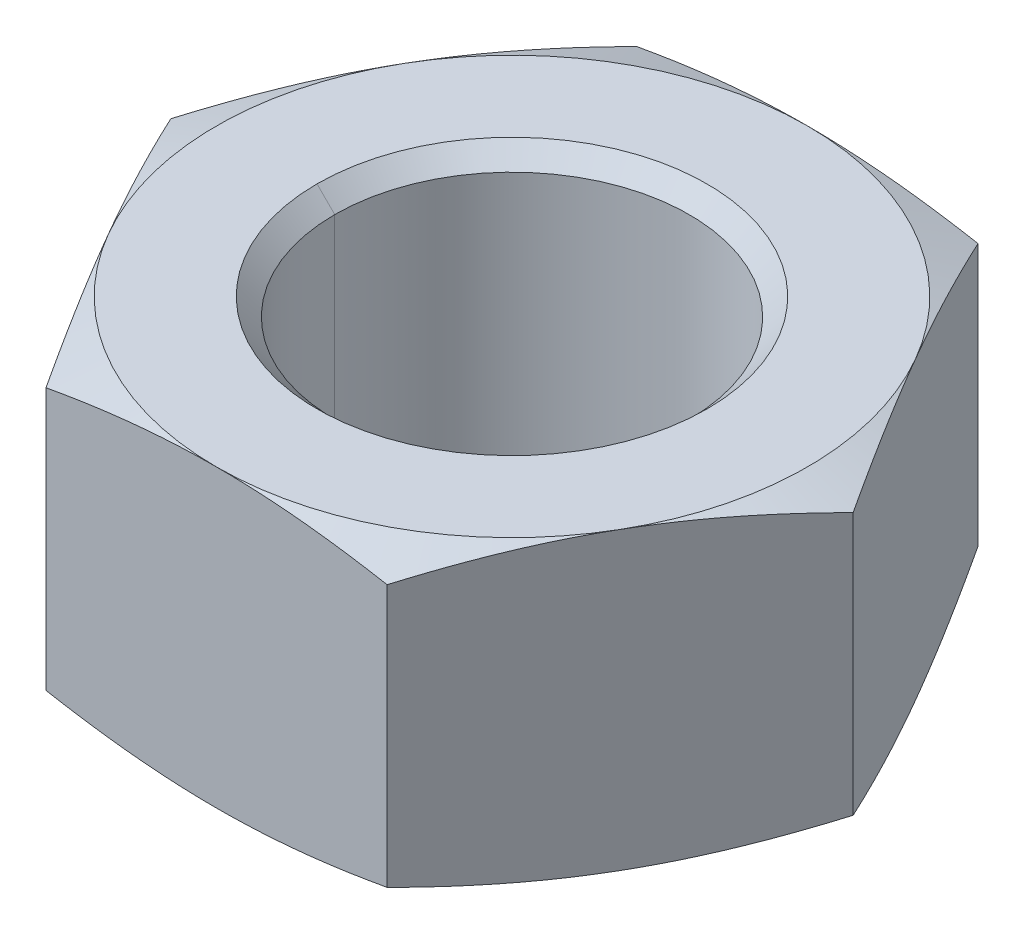
ISO-10303-21;
HEADER;
FILE_DESCRIPTION(('STEP AP214'),'2;1');
FILE_NAME('part.step','',(''),(''),'','','');
FILE_SCHEMA(('AUTOMOTIVE_DESIGN { 1 0 10303 214 1 1 1 1 }'));
ENDSEC;
DATA;
#1=APPLICATION_CONTEXT('core data for automotive mechanical design processes');
#2=APPLICATION_PROTOCOL_DEFINITION('international standard','automotive_design',2000,#1);
#3=PRODUCT_CONTEXT('',#1,'mechanical');
#4=PRODUCT('Part','Part','',(#3));
#5=PRODUCT_RELATED_PRODUCT_CATEGORY('part','',(#4));
#6=PRODUCT_DEFINITION_FORMATION('','',#4);
#7=PRODUCT_DEFINITION_CONTEXT('part definition',#1,'design');
#8=PRODUCT_DEFINITION('design','',#6,#7);
#9=PRODUCT_DEFINITION_SHAPE('','',#8);
#10=(LENGTH_UNIT() NAMED_UNIT(*) SI_UNIT(.MILLI.,.METRE.));
#11=(NAMED_UNIT(*) PLANE_ANGLE_UNIT() SI_UNIT($,.RADIAN.));
#12=(NAMED_UNIT(*) SI_UNIT($,.STERADIAN.) SOLID_ANGLE_UNIT());
#13=UNCERTAINTY_MEASURE_WITH_UNIT(LENGTH_MEASURE(1.E-05),#10,'distance_accuracy_value','');
#14=(GEOMETRIC_REPRESENTATION_CONTEXT(3) GLOBAL_UNCERTAINTY_ASSIGNED_CONTEXT((#13)) GLOBAL_UNIT_ASSIGNED_CONTEXT((#10,
#11,#12)) REPRESENTATION_CONTEXT('',''));
#15=CARTESIAN_POINT('',(0.,0.,0.));
#16=DIRECTION('',(0.,0.,1.));
#17=DIRECTION('',(1.,0.,0.));
#18=AXIS2_PLACEMENT_3D('',#15,#16,#17);
#19=CARTESIAN_POINT('',(0.,0.1500000001118,0.));
#20=DIRECTION('',(0.,-1.,0.));
#21=DIRECTION('',(0.,0.,-1.));
#22=AXIS2_PLACEMENT_3D('',#19,#20,#21);
#23=CONICAL_SURFACE('',#22,3.149999999888,0.7853981633973);
#24=DIRECTION('',(-0.707106781186548,0.707106781186548,1.40304943014409E-09));
#25=VECTOR('',#24,1.);
#26=CARTESIAN_POINT('',(3.299999999873,1.269596279959E-10,-1.870828766037E-09));
#27=LINE('',#26,#25);
#28=CARTESIAN_POINT('',(3.3,0.,0.));
#29=VERTEX_POINT('',#28);
#30=CARTESIAN_POINT('',(3.,0.3,0.));
#31=VERTEX_POINT('',#30);
#32=EDGE_CURVE('E11',#29,#31,#27,.T.);
#33=ORIENTED_EDGE('',*,*,#32,.T.);
#34=CARTESIAN_POINT('',(0.,0.3,0.));
#35=DIRECTION('',(0.,1.,0.));
#36=DIRECTION('',(1.,0.,0.));
#37=AXIS2_PLACEMENT_3D('',#34,#35,#36);
#38=CIRCLE('',#37,3.);
#39=CARTESIAN_POINT('',(-3.,0.3,0.));
#40=VERTEX_POINT('',#39);
#41=EDGE_CURVE('E156',#31,#40,#38,.T.);
#42=ORIENTED_EDGE('',*,*,#41,.T.);
#43=DIRECTION('',(0.707106781186548,0.707106781186548,-1.40305061831209E-09));
#44=VECTOR('',#43,1.);
#45=CARTESIAN_POINT('',(-3.299999999873,1.269594799661E-10,1.870829433606E-09));
#46=LINE('',#45,#44);
#47=CARTESIAN_POINT('',(-3.3,0.,0.));
#48=VERTEX_POINT('',#47);
#49=EDGE_CURVE('E26',#48,#40,#46,.T.);
#50=ORIENTED_EDGE('',*,*,#49,.F.);
#51=CARTESIAN_POINT('',(0.,0.,0.));
#52=DIRECTION('',(0.,1.,0.));
#53=DIRECTION('',(1.,0.,0.));
#54=AXIS2_PLACEMENT_3D('',#51,#52,#53);
#55=CIRCLE('',#54,3.3);
#56=EDGE_CURVE('E263',#29,#48,#55,.T.);
#57=ORIENTED_EDGE('',*,*,#56,.F.);
#58=EDGE_LOOP('',(#33,#42,#50,#57));
#59=FACE_BOUND('',#58,.T.);
#60=ADVANCED_FACE('F16',(#59),#23,.F.);
#61=CARTESIAN_POINT('',(0.,0.1500000001118,0.));
#62=DIRECTION('',(0.,-1.,0.));
#63=DIRECTION('',(0.,0.,-1.));
#64=AXIS2_PLACEMENT_3D('',#61,#62,#63);
#65=CONICAL_SURFACE('',#64,3.149999999888,0.7853981633973);
#66=ORIENTED_EDGE('',*,*,#49,.T.);
#67=CARTESIAN_POINT('',(0.,0.3,0.));
#68=DIRECTION('',(0.,1.,0.));
#69=DIRECTION('',(-1.,0.,0.));
#70=AXIS2_PLACEMENT_3D('',#67,#68,#69);
#71=CIRCLE('',#70,3.);
#72=EDGE_CURVE('E158',#40,#31,#71,.T.);
#73=ORIENTED_EDGE('',*,*,#72,.T.);
#74=ORIENTED_EDGE('',*,*,#32,.F.);
#75=CARTESIAN_POINT('',(0.,0.,0.));
#76=DIRECTION('',(0.,1.,0.));
#77=DIRECTION('',(-1.,0.,0.));
#78=AXIS2_PLACEMENT_3D('',#75,#76,#77);
#79=CIRCLE('',#78,3.3);
#80=EDGE_CURVE('E384',#48,#29,#79,.T.);
#81=ORIENTED_EDGE('',*,*,#80,.F.);
#82=EDGE_LOOP('',(#66,#73,#74,#81));
#83=FACE_BOUND('',#82,.T.);
#84=ADVANCED_FACE('F499',(#83),#65,.F.);
#85=CARTESIAN_POINT('',(0.,5.,0.));
#86=DIRECTION('',(0.,1.,0.));
#87=DIRECTION('',(1.,0.,0.));
#88=AXIS2_PLACEMENT_3D('',#85,#86,#87);
#89=CYLINDRICAL_SURFACE('',#88,3.);
#90=DIRECTION('',(0.,-1.,0.));
#91=VECTOR('',#90,1.);
#92=CARTESIAN_POINT('',(2.999999999913,4.699999999913,-1.27556486884E-09));
#93=LINE('',#92,#91);
#94=CARTESIAN_POINT('',(3.,4.7,0.));
#95=VERTEX_POINT('',#94);
#96=EDGE_CURVE('E151',#95,#31,#93,.T.);
#97=ORIENTED_EDGE('',*,*,#96,.T.);
#98=ORIENTED_EDGE('',*,*,#72,.F.);
#99=DIRECTION('',(0.,-1.,0.));
#100=VECTOR('',#99,1.);
#101=CARTESIAN_POINT('',(-2.999999999913,4.699999999913,1.275564635322E-09));
#102=LINE('',#101,#100);
#103=CARTESIAN_POINT('',(-3.,4.7,0.));
#104=VERTEX_POINT('',#103);
#105=EDGE_CURVE('E143',#104,#40,#102,.T.);
#106=ORIENTED_EDGE('',*,*,#105,.F.);
#107=CARTESIAN_POINT('',(0.,4.7,0.));
#108=DIRECTION('',(0.,-1.,0.));
#109=DIRECTION('',(1.,0.,0.));
#110=AXIS2_PLACEMENT_3D('',#107,#108,#109);
#111=CIRCLE('',#110,3.);
#112=EDGE_CURVE('E170',#95,#104,#111,.T.);
#113=ORIENTED_EDGE('',*,*,#112,.F.);
#114=EDGE_LOOP('',(#97,#98,#106,#113));
#115=FACE_BOUND('',#114,.T.);
#116=ADVANCED_FACE('F171',(#115),#89,.F.);
#117=CARTESIAN_POINT('',(0.,5.,0.));
#118=DIRECTION('',(0.,1.,0.));
#119=DIRECTION('',(1.,0.,0.));
#120=AXIS2_PLACEMENT_3D('',#117,#118,#119);
#121=CYLINDRICAL_SURFACE('',#120,3.);
#122=ORIENTED_EDGE('',*,*,#105,.T.);
#123=ORIENTED_EDGE('',*,*,#41,.F.);
#124=ORIENTED_EDGE('',*,*,#96,.F.);
#125=CARTESIAN_POINT('',(0.,4.7,0.));
#126=DIRECTION('',(0.,-1.,0.));
#127=DIRECTION('',(-1.,0.,0.));
#128=AXIS2_PLACEMENT_3D('',#125,#126,#127);
#129=CIRCLE('',#128,3.);
#130=EDGE_CURVE('E154',#104,#95,#129,.T.);
#131=ORIENTED_EDGE('',*,*,#130,.F.);
#132=EDGE_LOOP('',(#122,#123,#124,#131));
#133=FACE_BOUND('',#132,.T.);
#134=ADVANCED_FACE('F153',(#133),#121,.F.);
#135=CARTESIAN_POINT('',(0.,4.849999999888,0.));
#136=DIRECTION('',(0.,1.,0.));
#137=DIRECTION('',(0.,0.,-1.));
#138=AXIS2_PLACEMENT_3D('',#135,#136,#137);
#139=CONICAL_SURFACE('',#138,3.149999999888,0.7853981633973);
#140=DIRECTION('',(0.707106781186548,-0.707106781186548,-1.40305006739409E-09));
#141=VECTOR('',#140,1.);
#142=CARTESIAN_POINT('',(-3.299999999873,4.999999999873,1.870828365441E-09));
#143=LINE('',#142,#141);
#144=CARTESIAN_POINT('',(-3.3,5.,0.));
#145=VERTEX_POINT('',#144);
#146=EDGE_CURVE('E166',#145,#104,#143,.T.);
#147=ORIENTED_EDGE('',*,*,#146,.T.);
#148=ORIENTED_EDGE('',*,*,#130,.T.);
#149=DIRECTION('',(-0.707106781186548,-0.707106781186548,1.40305109366909E-09));
#150=VECTOR('',#149,1.);
#151=CARTESIAN_POINT('',(3.299999999873,4.999999999873,-1.870829034371E-09));
#152=LINE('',#151,#150);
#153=CARTESIAN_POINT('',(3.3,5.,0.));
#154=VERTEX_POINT('',#153);
#155=EDGE_CURVE('E164',#154,#95,#152,.T.);
#156=ORIENTED_EDGE('',*,*,#155,.F.);
#157=CARTESIAN_POINT('',(0.,5.,0.));
#158=DIRECTION('',(0.,-1.,0.));
#159=DIRECTION('',(-1.,0.,0.));
#160=AXIS2_PLACEMENT_3D('',#157,#158,#159);
#161=CIRCLE('',#160,3.3);
#162=EDGE_CURVE('E189',#145,#154,#161,.T.);
#163=ORIENTED_EDGE('',*,*,#162,.F.);
#164=EDGE_LOOP('',(#147,#148,#156,#163));
#165=FACE_BOUND('',#164,.T.);
#166=ADVANCED_FACE('F161',(#165),#139,.F.);
#167=CARTESIAN_POINT('',(0.,4.849999999888,0.));
#168=DIRECTION('',(0.,1.,0.));
#169=DIRECTION('',(0.,0.,-1.));
#170=AXIS2_PLACEMENT_3D('',#167,#168,#169);
#171=CONICAL_SURFACE('',#170,3.149999999888,0.7853981633973);
#172=ORIENTED_EDGE('',*,*,#155,.T.);
#173=ORIENTED_EDGE('',*,*,#112,.T.);
#174=ORIENTED_EDGE('',*,*,#146,.F.);
#175=CARTESIAN_POINT('',(0.,5.,0.));
#176=DIRECTION('',(0.,-1.,0.));
#177=DIRECTION('',(1.,0.,0.));
#178=AXIS2_PLACEMENT_3D('',#175,#176,#177);
#179=CIRCLE('',#178,3.3);
#180=EDGE_CURVE('E177',#154,#145,#179,.T.);
#181=ORIENTED_EDGE('',*,*,#180,.F.);
#182=EDGE_LOOP('',(#172,#173,#174,#181));
#183=FACE_BOUND('',#182,.T.);
#184=ADVANCED_FACE('F175',(#183),#171,.F.);
#185=CARTESIAN_POINT('',(2.886751345948,0.,-5.));
#186=DIRECTION('',(0.,0.,-1.));
#187=DIRECTION('',(0.,-1.,0.));
#188=AXIS2_PLACEMENT_3D('',#185,#186,#187);
#189=PLANE('',#188);
#190=CARTESIAN_POINT('',(0.,5.,-5.));
#191=CARTESIAN_POINT('',(0.1913135612764,5.,-5.));
#192=CARTESIAN_POINT('',(0.5735400361145,4.991978028235,-5.));
#193=CARTESIAN_POINT('',(1.145396912919,4.956536750021,-5.));
#194=CARTESIAN_POINT('',(1.716614457056,4.899087181771,-5.));
#195=CARTESIAN_POINT('',(2.291496330434,4.821082029169,-5.));
#196=CARTESIAN_POINT('',(2.686825860111,4.754851506983,-5.));
#197=CARTESIAN_POINT('',(2.886751345948,4.718468044025,-5.));
#198=(BOUNDED_CURVE() B_SPLINE_CURVE(3,(#190,#191,#192,#193,#194,#195,#196,#197),.UNSPECIFIED.,
.F.,.F.) B_SPLINE_CURVE_WITH_KNOTS((4,1,1,1,1,4),(0.,0.2,0.4,0.6,0.8,1.),
.UNSPECIFIED.) CURVE() GEOMETRIC_REPRESENTATION_ITEM() RATIONAL_B_SPLINE_CURVE((1.,1.,1.,1.,1.,
1.,1.,1.)) REPRESENTATION_ITEM(''));
#199=CARTESIAN_POINT('',(0.,5.,-5.));
#200=VERTEX_POINT('',#199);
#201=CARTESIAN_POINT('',(2.886751345948,4.718468044025,-5.));
#202=VERTEX_POINT('',#201);
#203=EDGE_CURVE('E212',#200,#202,#198,.T.);
#204=ORIENTED_EDGE('',*,*,#203,.T.);
#205=DIRECTION('',(0.,1.,0.));
#206=VECTOR('',#205,1.);
#207=CARTESIAN_POINT('',(2.886751345948,0.281531955975,-5.));
#208=LINE('',#207,#206);
#209=CARTESIAN_POINT('',(2.886751345948,0.281531955975,-5.));
#210=VERTEX_POINT('',#209);
#211=EDGE_CURVE('E383',#210,#202,#208,.T.);
#212=ORIENTED_EDGE('',*,*,#211,.F.);
#213=CARTESIAN_POINT('',(0.,0.,-5.));
#214=CARTESIAN_POINT('',(0.1913135612764,0.,-5.));
#215=CARTESIAN_POINT('',(0.5735400361145,0.0080219717654,-5.));
#216=CARTESIAN_POINT('',(1.145396912919,0.0434632499789,-5.));
#217=CARTESIAN_POINT('',(1.716614457056,0.1009128182289,-5.));
#218=CARTESIAN_POINT('',(2.291496330434,0.1789179708305,-5.));
#219=CARTESIAN_POINT('',(2.686825860111,0.2451484930171,-5.));
#220=CARTESIAN_POINT('',(2.886751345948,0.281531955975,-5.));
#221=(BOUNDED_CURVE() B_SPLINE_CURVE(3,(#213,#214,#215,#216,#217,#218,#219,#220),.UNSPECIFIED.,
.F.,.F.) B_SPLINE_CURVE_WITH_KNOTS((4,1,1,1,1,4),(0.,0.2,0.4,0.6,0.8,1.),
.UNSPECIFIED.) CURVE() GEOMETRIC_REPRESENTATION_ITEM() RATIONAL_B_SPLINE_CURVE((1.,1.,1.,1.,1.,
1.,1.,1.)) REPRESENTATION_ITEM(''));
#222=CARTESIAN_POINT('',(0.,0.,-5.));
#223=VERTEX_POINT('',#222);
#224=EDGE_CURVE('E391',#223,#210,#221,.T.);
#225=ORIENTED_EDGE('',*,*,#224,.F.);
#226=CARTESIAN_POINT('',(-2.886751345948,0.281531955975,-5.));
#227=CARTESIAN_POINT('',(-2.686842350462,0.2451514940155,-5.));
#228=CARTESIAN_POINT('',(-2.291523503656,0.1789206848671,-5.));
#229=CARTESIAN_POINT('',(-1.716445748794,0.1008913994102,-5.));
#230=CARTESIAN_POINT('',(-1.145247513921,0.04345198182314,-5.));
#231=CARTESIAN_POINT('',(-0.5734568332924,0.008019431503116,-5.));
#232=CARTESIAN_POINT('',(-0.1912831301442,0.,-5.));
#233=CARTESIAN_POINT('',(0.,0.,-5.));
#234=(BOUNDED_CURVE() B_SPLINE_CURVE(3,(#226,#227,#228,#229,#230,#231,#232,#233),.UNSPECIFIED.,
.F.,.F.) B_SPLINE_CURVE_WITH_KNOTS((4,1,1,1,1,4),(0.,0.2,0.4,0.6,0.8,1.),
.UNSPECIFIED.) CURVE() GEOMETRIC_REPRESENTATION_ITEM() RATIONAL_B_SPLINE_CURVE((1.,1.,1.,1.,1.,
1.,1.,1.)) REPRESENTATION_ITEM(''));
#235=CARTESIAN_POINT('',(-2.886751345948,0.281531955975,-5.));
#236=VERTEX_POINT('',#235);
#237=EDGE_CURVE('E255',#236,#223,#234,.T.);
#238=ORIENTED_EDGE('',*,*,#237,.F.);
#239=DIRECTION('',(0.,1.,0.));
#240=VECTOR('',#239,1.);
#241=CARTESIAN_POINT('',(-2.886751345948,0.281531955975,-5.));
#242=LINE('',#241,#240);
#243=CARTESIAN_POINT('',(-2.886751345948,4.718468044025,-5.));
#244=VERTEX_POINT('',#243);
#245=EDGE_CURVE('E180',#236,#244,#242,.T.);
#246=ORIENTED_EDGE('',*,*,#245,.T.);
#247=CARTESIAN_POINT('',(-2.886751345948,4.718468044025,-5.));
#248=CARTESIAN_POINT('',(-2.686842350462,4.754848505985,-5.));
#249=CARTESIAN_POINT('',(-2.291523503656,4.821079315133,-5.));
#250=CARTESIAN_POINT('',(-1.716445748794,4.89910860059,-5.));
#251=CARTESIAN_POINT('',(-1.145247513921,4.956548018177,-5.));
#252=CARTESIAN_POINT('',(-0.5734568332925,4.991980568497,-5.));
#253=CARTESIAN_POINT('',(-0.1912831301442,5.,-5.));
#254=CARTESIAN_POINT('',(0.,5.,-5.));
#255=(BOUNDED_CURVE() B_SPLINE_CURVE(3,(#247,#248,#249,#250,#251,#252,#253,#254),.UNSPECIFIED.,
.F.,.F.) B_SPLINE_CURVE_WITH_KNOTS((4,1,1,1,1,4),(0.,0.2,0.4,0.6,0.8,1.),
.UNSPECIFIED.) CURVE() GEOMETRIC_REPRESENTATION_ITEM() RATIONAL_B_SPLINE_CURVE((1.,1.,1.,1.,1.,
1.,1.,1.)) REPRESENTATION_ITEM(''));
#256=EDGE_CURVE('E211',#244,#200,#255,.T.);
#257=ORIENTED_EDGE('',*,*,#256,.T.);
#258=EDGE_LOOP('',(#204,#212,#225,#238,#246,#257));
#259=FACE_BOUND('',#258,.T.);
#260=ADVANCED_FACE('F520',(#259),#189,.T.);
#261=CARTESIAN_POINT('',(-2.886751345948,0.,-5.));
#262=DIRECTION('',(-0.866025403784429,0.,-0.500000000000017));
#263=DIRECTION('',(-0.500000000000017,0.,0.866025403784429));
#264=AXIS2_PLACEMENT_3D('',#261,#262,#263);
#265=PLANE('',#264);
#266=CARTESIAN_POINT('',(-4.330127018922,5.,-2.5));
#267=CARTESIAN_POINT('',(-4.234470238284,5.,-2.665682404154));
#268=CARTESIAN_POINT('',(-4.043357000865,4.991978028235,-2.996700241363));
#269=CARTESIAN_POINT('',(-3.757428562463,4.956536750021,-3.491942824004));
#270=CARTESIAN_POINT('',(-3.471819790394,4.899087181771,-3.986631728314));
#271=CARTESIAN_POINT('',(-3.184378853705,4.821082029169,-4.484494034835));
#272=CARTESIAN_POINT('',(-2.986714088867,4.754851506983,-4.826859450401));
#273=CARTESIAN_POINT('',(-2.886751345948,4.718468044025,-5.));
#274=(BOUNDED_CURVE() B_SPLINE_CURVE(3,(#266,#267,#268,#269,#270,#271,#272,#273),.UNSPECIFIED.,
.F.,.F.) B_SPLINE_CURVE_WITH_KNOTS((4,1,1,1,1,4),(0.,0.2,0.4,0.6,0.8,1.),
.UNSPECIFIED.) CURVE() GEOMETRIC_REPRESENTATION_ITEM() RATIONAL_B_SPLINE_CURVE((1.,1.,1.,1.,1.,
1.,1.,1.)) REPRESENTATION_ITEM(''));
#275=CARTESIAN_POINT('',(-4.330127018922,5.,-2.5));
#276=VERTEX_POINT('',#275);
#277=EDGE_CURVE('E223',#276,#244,#274,.T.);
#278=ORIENTED_EDGE('',*,*,#277,.T.);
#279=ORIENTED_EDGE('',*,*,#245,.F.);
#280=CARTESIAN_POINT('',(-4.330127018922,0.,-2.5));
#281=CARTESIAN_POINT('',(-4.234470238284,0.,-2.665682404154));
#282=CARTESIAN_POINT('',(-4.043357000865,0.0080219717654,-2.996700241363));
#283=CARTESIAN_POINT('',(-3.757428562463,0.0434632499789,-3.491942824004));
#284=CARTESIAN_POINT('',(-3.471819790394,0.1009128182289,-3.986631728314));
#285=CARTESIAN_POINT('',(-3.184378853705,0.1789179708305,-4.484494034835));
#286=CARTESIAN_POINT('',(-2.986714088867,0.2451484930171,-4.826859450401));
#287=CARTESIAN_POINT('',(-2.886751345948,0.281531955975,-5.));
#288=(BOUNDED_CURVE() B_SPLINE_CURVE(3,(#280,#281,#282,#283,#284,#285,#286,#287),.UNSPECIFIED.,
.F.,.F.) B_SPLINE_CURVE_WITH_KNOTS((4,1,1,1,1,4),(0.,0.2,0.4,0.6,0.8,1.),
.UNSPECIFIED.) CURVE() GEOMETRIC_REPRESENTATION_ITEM() RATIONAL_B_SPLINE_CURVE((1.,1.,1.,1.,1.,
1.,1.,1.)) REPRESENTATION_ITEM(''));
#289=CARTESIAN_POINT('',(-4.330127018922,0.,-2.5));
#290=VERTEX_POINT('',#289);
#291=EDGE_CURVE('E249',#290,#236,#288,.T.);
#292=ORIENTED_EDGE('',*,*,#291,.F.);
#293=CARTESIAN_POINT('',(-5.773502691896,0.281531955975,0.));
#294=CARTESIAN_POINT('',(-5.673548194153,0.2451514940155,-0.1731262685361));
#295=CARTESIAN_POINT('',(-5.47588877075,0.1789206848671,-0.5154824324645));
#296=CARTESIAN_POINT('',(-5.188349893319,0.1008913994102,-1.013514377327));
#297=CARTESIAN_POINT('',(-4.902750775883,0.04345198182314,-1.508186559323));
#298=CARTESIAN_POINT('',(-4.616855435568,0.008019431503118,-2.003371814395));
#299=CARTESIAN_POINT('',(-4.425768583994,0.,-2.33434394998));
#300=CARTESIAN_POINT('',(-4.330127018922,0.,-2.5));
#301=(BOUNDED_CURVE() B_SPLINE_CURVE(3,(#293,#294,#295,#296,#297,#298,#299,#300),.UNSPECIFIED.,
.F.,.F.) B_SPLINE_CURVE_WITH_KNOTS((4,1,1,1,1,4),(0.,0.2,0.4,0.6,0.8,1.),
.UNSPECIFIED.) CURVE() GEOMETRIC_REPRESENTATION_ITEM() RATIONAL_B_SPLINE_CURVE((1.,1.,1.,1.,1.,
1.,1.,1.)) REPRESENTATION_ITEM(''));
#302=CARTESIAN_POINT('',(-5.773502691896,0.281531955975,0.));
#303=VERTEX_POINT('',#302);
#304=EDGE_CURVE('E197',#303,#290,#301,.T.);
#305=ORIENTED_EDGE('',*,*,#304,.F.);
#306=DIRECTION('',(0.,1.,0.));
#307=VECTOR('',#306,1.);
#308=CARTESIAN_POINT('',(-5.773502691896,0.281531955975,0.));
#309=LINE('',#308,#307);
#310=CARTESIAN_POINT('',(-5.773502691896,4.718468044025,0.));
#311=VERTEX_POINT('',#310);
#312=EDGE_CURVE('E185',#303,#311,#309,.T.);
#313=ORIENTED_EDGE('',*,*,#312,.T.);
#314=CARTESIAN_POINT('',(-5.773502691896,4.718468044025,0.));
#315=CARTESIAN_POINT('',(-5.673548194153,4.754848505985,-0.1731262685361));
#316=CARTESIAN_POINT('',(-5.47588877075,4.821079315133,-0.5154824324645));
#317=CARTESIAN_POINT('',(-5.188349893319,4.89910860059,-1.013514377327));
#318=CARTESIAN_POINT('',(-4.902750775883,4.956548018177,-1.508186559323));
#319=CARTESIAN_POINT('',(-4.616855435568,4.991980568497,-2.003371814395));
#320=CARTESIAN_POINT('',(-4.425768583994,5.,-2.33434394998));
#321=CARTESIAN_POINT('',(-4.330127018922,5.,-2.5));
#322=(BOUNDED_CURVE() B_SPLINE_CURVE(3,(#314,#315,#316,#317,#318,#319,#320,#321),.UNSPECIFIED.,
.F.,.F.) B_SPLINE_CURVE_WITH_KNOTS((4,1,1,1,1,4),(0.,0.2,0.4,0.6,0.8,1.),
.UNSPECIFIED.) CURVE() GEOMETRIC_REPRESENTATION_ITEM() RATIONAL_B_SPLINE_CURVE((1.,1.,1.,1.,1.,
1.,1.,1.)) REPRESENTATION_ITEM(''));
#323=EDGE_CURVE('E244',#311,#276,#322,.T.);
#324=ORIENTED_EDGE('',*,*,#323,.T.);
#325=EDGE_LOOP('',(#278,#279,#292,#305,#313,#324));
#326=FACE_BOUND('',#325,.T.);
#327=ADVANCED_FACE('F517',(#326),#265,.T.);
#328=CARTESIAN_POINT('',(-5.773502691896,0.,0.));
#329=DIRECTION('',(-0.866025403784429,0.,0.500000000000017));
#330=DIRECTION('',(0.,1.,0.));
#331=AXIS2_PLACEMENT_3D('',#328,#329,#330);
#332=PLANE('',#331);
#333=CARTESIAN_POINT('',(-4.330127018922,5.,2.5));
#334=CARTESIAN_POINT('',(-4.42578379956,5.,2.334317595846));
#335=CARTESIAN_POINT('',(-4.616897036979,4.991978028235,2.003299758637));
#336=CARTESIAN_POINT('',(-4.902825475382,4.956536750021,1.508057175996));
#337=CARTESIAN_POINT('',(-5.18843424745,4.899087181771,1.013368271686));
#338=CARTESIAN_POINT('',(-5.475875184139,4.821082029169,0.515505965165));
#339=CARTESIAN_POINT('',(-5.673539948978,4.754851506983,0.1731405495987));
#340=CARTESIAN_POINT('',(-5.773502691896,4.718468044025,0.));
#341=(BOUNDED_CURVE() B_SPLINE_CURVE(3,(#333,#334,#335,#336,#337,#338,#339,#340),.UNSPECIFIED.,
.F.,.F.) B_SPLINE_CURVE_WITH_KNOTS((4,1,1,1,1,4),(0.,0.2,0.4,0.6,0.8,1.),
.UNSPECIFIED.) CURVE() GEOMETRIC_REPRESENTATION_ITEM() RATIONAL_B_SPLINE_CURVE((1.,1.,1.,1.,1.,
1.,1.,1.)) REPRESENTATION_ITEM(''));
#342=CARTESIAN_POINT('',(-4.330127018922,5.,2.5));
#343=VERTEX_POINT('',#342);
#344=EDGE_CURVE('E396',#343,#311,#341,.T.);
#345=ORIENTED_EDGE('',*,*,#344,.T.);
#346=ORIENTED_EDGE('',*,*,#312,.F.);
#347=CARTESIAN_POINT('',(-4.330127018922,0.,2.5));
#348=CARTESIAN_POINT('',(-4.42578379956,0.,2.334317595846));
#349=CARTESIAN_POINT('',(-4.616897036979,0.0080219717654,2.003299758637));
#350=CARTESIAN_POINT('',(-4.902825475382,0.0434632499789,1.508057175996));
#351=CARTESIAN_POINT('',(-5.18843424745,0.1009128182289,1.013368271686));
#352=CARTESIAN_POINT('',(-5.475875184139,0.1789179708305,0.515505965165));
#353=CARTESIAN_POINT('',(-5.673539948978,0.2451484930171,0.1731405495987));
#354=CARTESIAN_POINT('',(-5.773502691896,0.281531955975,0.));
#355=(BOUNDED_CURVE() B_SPLINE_CURVE(3,(#347,#348,#349,#350,#351,#352,#353,#354),.UNSPECIFIED.,
.F.,.F.) B_SPLINE_CURVE_WITH_KNOTS((4,1,1,1,1,4),(0.,0.2,0.4,0.6,0.8,1.),
.UNSPECIFIED.) CURVE() GEOMETRIC_REPRESENTATION_ITEM() RATIONAL_B_SPLINE_CURVE((1.,1.,1.,1.,1.,
1.,1.,1.)) REPRESENTATION_ITEM(''));
#356=CARTESIAN_POINT('',(-4.330127018922,0.,2.5));
#357=VERTEX_POINT('',#356);
#358=EDGE_CURVE('E203',#357,#303,#355,.T.);
#359=ORIENTED_EDGE('',*,*,#358,.F.);
#360=CARTESIAN_POINT('',(-2.886751345948,0.281531955975,5.));
#361=CARTESIAN_POINT('',(-2.986705843691,0.2451514940155,4.826873731464));
#362=CARTESIAN_POINT('',(-3.184365267094,0.1789206848671,4.484517567536));
#363=CARTESIAN_POINT('',(-3.471904144525,0.1008913994102,3.986485622673));
#364=CARTESIAN_POINT('',(-3.757503261962,0.04345198182314,3.491813440677));
#365=CARTESIAN_POINT('',(-4.043398602276,0.008019431503118,2.996628185605));
#366=CARTESIAN_POINT('',(-4.23448545385,0.,2.66565605002));
#367=CARTESIAN_POINT('',(-4.330127018922,0.,2.5));
#368=(BOUNDED_CURVE() B_SPLINE_CURVE(3,(#360,#361,#362,#363,#364,#365,#366,#367),.UNSPECIFIED.,
.F.,.F.) B_SPLINE_CURVE_WITH_KNOTS((4,1,1,1,1,4),(0.,0.2,0.4,0.6,0.8,1.),
.UNSPECIFIED.) CURVE() GEOMETRIC_REPRESENTATION_ITEM() RATIONAL_B_SPLINE_CURVE((1.,1.,1.,1.,1.,
1.,1.,1.)) REPRESENTATION_ITEM(''));
#369=CARTESIAN_POINT('',(-2.886751345948,0.281531955975,5.));
#370=VERTEX_POINT('',#369);
#371=EDGE_CURVE('E269',#370,#357,#368,.T.);
#372=ORIENTED_EDGE('',*,*,#371,.F.);
#373=DIRECTION('',(0.,1.,0.));
#374=VECTOR('',#373,1.);
#375=CARTESIAN_POINT('',(-2.886751345948,0.281531955975,5.));
#376=LINE('',#375,#374);
#377=CARTESIAN_POINT('',(-2.886751345948,4.718468044025,5.));
#378=VERTEX_POINT('',#377);
#379=EDGE_CURVE('E377',#370,#378,#376,.T.);
#380=ORIENTED_EDGE('',*,*,#379,.T.);
#381=CARTESIAN_POINT('',(-2.886751345948,4.718468044025,5.));
#382=CARTESIAN_POINT('',(-2.986705843691,4.754848505985,4.826873731464));
#383=CARTESIAN_POINT('',(-3.184365267094,4.821079315133,4.484517567536));
#384=CARTESIAN_POINT('',(-3.471904144525,4.89910860059,3.986485622673));
#385=CARTESIAN_POINT('',(-3.757503261962,4.956548018177,3.491813440677));
#386=CARTESIAN_POINT('',(-4.043398602276,4.991980568497,2.996628185605));
#387=CARTESIAN_POINT('',(-4.23448545385,5.,2.66565605002));
#388=CARTESIAN_POINT('',(-4.330127018922,5.,2.5));
#389=(BOUNDED_CURVE() B_SPLINE_CURVE(3,(#381,#382,#383,#384,#385,#386,#387,#388),.UNSPECIFIED.,
.F.,.F.) B_SPLINE_CURVE_WITH_KNOTS((4,1,1,1,1,4),(0.,0.2,0.4,0.6,0.8,1.),
.UNSPECIFIED.) CURVE() GEOMETRIC_REPRESENTATION_ITEM() RATIONAL_B_SPLINE_CURVE((1.,1.,1.,1.,1.,
1.,1.,1.)) REPRESENTATION_ITEM(''));
#390=EDGE_CURVE('E292',#378,#343,#389,.T.);
#391=ORIENTED_EDGE('',*,*,#390,.T.);
#392=EDGE_LOOP('',(#345,#346,#359,#372,#380,#391));
#393=FACE_BOUND('',#392,.T.);
#394=ADVANCED_FACE('F449',(#393),#332,.T.);
#395=CARTESIAN_POINT('',(-2.886751345948,0.,5.));
#396=DIRECTION('',(0.,0.,1.));
#397=DIRECTION('',(1.,0.,0.));
#398=AXIS2_PLACEMENT_3D('',#395,#396,#397);
#399=PLANE('',#398);
#400=CARTESIAN_POINT('',(0.,5.,5.));
#401=CARTESIAN_POINT('',(-0.1913135612764,5.,5.));
#402=CARTESIAN_POINT('',(-0.5735400361145,4.991978028235,5.));
#403=CARTESIAN_POINT('',(-1.145396912919,4.956536750021,5.));
#404=CARTESIAN_POINT('',(-1.716614457056,4.899087181771,5.));
#405=CARTESIAN_POINT('',(-2.291496330434,4.821082029169,5.));
#406=CARTESIAN_POINT('',(-2.686825860111,4.754851506983,5.));
#407=CARTESIAN_POINT('',(-2.886751345948,4.718468044025,5.));
#408=(BOUNDED_CURVE() B_SPLINE_CURVE(3,(#400,#401,#402,#403,#404,#405,#406,#407),.UNSPECIFIED.,
.F.,.F.) B_SPLINE_CURVE_WITH_KNOTS((4,1,1,1,1,4),(0.,0.2,0.4,0.6,0.8,1.),
.UNSPECIFIED.) CURVE() GEOMETRIC_REPRESENTATION_ITEM() RATIONAL_B_SPLINE_CURVE((1.,1.,1.,1.,1.,
1.,1.,1.)) REPRESENTATION_ITEM(''));
#409=CARTESIAN_POINT('',(0.,5.,5.));
#410=VERTEX_POINT('',#409);
#411=EDGE_CURVE('E287',#410,#378,#408,.T.);
#412=ORIENTED_EDGE('',*,*,#411,.T.);
#413=ORIENTED_EDGE('',*,*,#379,.F.);
#414=CARTESIAN_POINT('',(0.,0.,5.));
#415=CARTESIAN_POINT('',(-0.1913135612764,0.,5.));
#416=CARTESIAN_POINT('',(-0.5735400361145,0.0080219717654,5.));
#417=CARTESIAN_POINT('',(-1.145396912919,0.0434632499789,5.));
#418=CARTESIAN_POINT('',(-1.716614457056,0.1009128182289,5.));
#419=CARTESIAN_POINT('',(-2.291496330434,0.1789179708305,5.));
#420=CARTESIAN_POINT('',(-2.686825860111,0.2451484930171,5.));
#421=CARTESIAN_POINT('',(-2.886751345948,0.281531955975,5.));
#422=(BOUNDED_CURVE() B_SPLINE_CURVE(3,(#414,#415,#416,#417,#418,#419,#420,#421),.UNSPECIFIED.,
.F.,.F.) B_SPLINE_CURVE_WITH_KNOTS((4,1,1,1,1,4),(0.,0.2,0.4,0.6,0.8,1.),
.UNSPECIFIED.) CURVE() GEOMETRIC_REPRESENTATION_ITEM() RATIONAL_B_SPLINE_CURVE((1.,1.,1.,1.,1.,
1.,1.,1.)) REPRESENTATION_ITEM(''));
#423=CARTESIAN_POINT('',(0.,0.,5.));
#424=VERTEX_POINT('',#423);
#425=EDGE_CURVE('E234',#424,#370,#422,.T.);
#426=ORIENTED_EDGE('',*,*,#425,.F.);
#427=CARTESIAN_POINT('',(2.886751345948,0.281531955975,5.));
#428=CARTESIAN_POINT('',(2.686842350462,0.2451514940155,5.));
#429=CARTESIAN_POINT('',(2.291523503656,0.1789206848671,5.));
#430=CARTESIAN_POINT('',(1.716445748794,0.1008913994102,5.));
#431=CARTESIAN_POINT('',(1.145247513921,0.04345198182314,5.));
#432=CARTESIAN_POINT('',(0.5734568332924,0.008019431503117,5.));
#433=CARTESIAN_POINT('',(0.1912831301442,0.,5.));
#434=CARTESIAN_POINT('',(0.,0.,5.));
#435=(BOUNDED_CURVE() B_SPLINE_CURVE(3,(#427,#428,#429,#430,#431,#432,#433,#434),.UNSPECIFIED.,
.F.,.F.) B_SPLINE_CURVE_WITH_KNOTS((4,1,1,1,1,4),(0.,0.2,0.4,0.6,0.8,1.),
.UNSPECIFIED.) CURVE() GEOMETRIC_REPRESENTATION_ITEM() RATIONAL_B_SPLINE_CURVE((1.,1.,1.,1.,1.,
1.,1.,1.)) REPRESENTATION_ITEM(''));
#436=CARTESIAN_POINT('',(2.886751345948,0.281531955975,5.));
#437=VERTEX_POINT('',#436);
#438=EDGE_CURVE('E229',#437,#424,#435,.T.);
#439=ORIENTED_EDGE('',*,*,#438,.F.);
#440=DIRECTION('',(0.,1.,0.));
#441=VECTOR('',#440,1.);
#442=CARTESIAN_POINT('',(2.886751345948,0.281531955975,5.));
#443=LINE('',#442,#441);
#444=CARTESIAN_POINT('',(2.886751345948,4.718468044025,5.));
#445=VERTEX_POINT('',#444);
#446=EDGE_CURVE('E270',#437,#445,#443,.T.);
#447=ORIENTED_EDGE('',*,*,#446,.T.);
#448=CARTESIAN_POINT('',(2.886751345948,4.718468044025,5.));
#449=CARTESIAN_POINT('',(2.686842350462,4.754848505985,5.));
#450=CARTESIAN_POINT('',(2.291523503656,4.821079315133,5.));
#451=CARTESIAN_POINT('',(1.716445748794,4.89910860059,5.));
#452=CARTESIAN_POINT('',(1.145247513921,4.956548018177,5.));
#453=CARTESIAN_POINT('',(0.5734568332924,4.991980568497,5.));
#454=CARTESIAN_POINT('',(0.1912831301442,5.,5.));
#455=CARTESIAN_POINT('',(0.,5.,5.));
#456=(BOUNDED_CURVE() B_SPLINE_CURVE(3,(#448,#449,#450,#451,#452,#453,#454,#455),.UNSPECIFIED.,
.F.,.F.) B_SPLINE_CURVE_WITH_KNOTS((4,1,1,1,1,4),(0.,0.2,0.4,0.6,0.8,1.),
.UNSPECIFIED.) CURVE() GEOMETRIC_REPRESENTATION_ITEM() RATIONAL_B_SPLINE_CURVE((1.,1.,1.,1.,1.,
1.,1.,1.)) REPRESENTATION_ITEM(''));
#457=EDGE_CURVE('E371',#445,#410,#456,.T.);
#458=ORIENTED_EDGE('',*,*,#457,.T.);
#459=EDGE_LOOP('',(#412,#413,#426,#439,#447,#458));
#460=FACE_BOUND('',#459,.T.);
#461=ADVANCED_FACE('F453',(#460),#399,.T.);
#462=CARTESIAN_POINT('',(0.,0.1407659779875,0.));
#463=DIRECTION('',(0.,1.,0.));
#464=DIRECTION('',(1.,0.,0.));
#465=AXIS2_PLACEMENT_3D('',#462,#463,#464);
#466=CONICAL_SURFACE('',#465,5.386751345948,1.2217304763958);
#467=CARTESIAN_POINT('',(4.330127018922,0.,-2.5));
#468=CARTESIAN_POINT('',(4.42578379956,0.,-2.334317595846));
#469=CARTESIAN_POINT('',(4.616897036979,0.0080219717654,-2.003299758637));
#470=CARTESIAN_POINT('',(4.902825475382,0.0434632499789,-1.508057175996));
#471=CARTESIAN_POINT('',(5.18843424745,0.1009128182289,-1.013368271686));
#472=CARTESIAN_POINT('',(5.475875184139,0.1789179708305,-0.515505965165));
#473=CARTESIAN_POINT('',(5.673539948978,0.2451484930171,-0.1731405495987));
#474=CARTESIAN_POINT('',(5.773502691896,0.281531955975,0.));
#475=(BOUNDED_CURVE() B_SPLINE_CURVE(3,(#467,#468,#469,#470,#471,#472,#473,#474),.UNSPECIFIED.,
.F.,.F.) B_SPLINE_CURVE_WITH_KNOTS((4,1,1,1,1,4),(0.,0.2,0.4,0.6,0.8,1.),
.UNSPECIFIED.) CURVE() GEOMETRIC_REPRESENTATION_ITEM() RATIONAL_B_SPLINE_CURVE((1.,1.,1.,1.,1.,
1.,1.,1.)) REPRESENTATION_ITEM(''));
#476=CARTESIAN_POINT('',(4.330127018922,0.,-2.5));
#477=VERTEX_POINT('',#476);
#478=CARTESIAN_POINT('',(5.773502691896,0.281531955975,0.));
#479=VERTEX_POINT('',#478);
#480=EDGE_CURVE('E217',#477,#479,#475,.T.);
#481=ORIENTED_EDGE('',*,*,#480,.T.);
#482=CARTESIAN_POINT('',(5.773502691896,0.281531955975,0.));
#483=CARTESIAN_POINT('',(5.673548194153,0.2451514940155,0.1731262685361));
#484=CARTESIAN_POINT('',(5.47588877075,0.1789206848671,0.5154824324645));
#485=CARTESIAN_POINT('',(5.188349893319,0.1008913994102,1.013514377327));
#486=CARTESIAN_POINT('',(4.902750775883,0.04345198182314,1.508186559323));
#487=CARTESIAN_POINT('',(4.616855435568,0.008019431503116,2.003371814395));
#488=CARTESIAN_POINT('',(4.425768583994,0.,2.33434394998));
#489=CARTESIAN_POINT('',(4.330127018922,0.,2.5));
#490=(BOUNDED_CURVE() B_SPLINE_CURVE(3,(#482,#483,#484,#485,#486,#487,#488,#489),.UNSPECIFIED.,
.F.,.F.) B_SPLINE_CURVE_WITH_KNOTS((4,1,1,1,1,4),(0.,0.2,0.4,0.6,0.8,1.),
.UNSPECIFIED.) CURVE() GEOMETRIC_REPRESENTATION_ITEM() RATIONAL_B_SPLINE_CURVE((1.,1.,1.,1.,1.,
1.,1.,1.)) REPRESENTATION_ITEM(''));
#491=CARTESIAN_POINT('',(4.330127018922,0.,2.5));
#492=VERTEX_POINT('',#491);
#493=EDGE_CURVE('E276',#479,#492,#490,.T.);
#494=ORIENTED_EDGE('',*,*,#493,.T.);
#495=CARTESIAN_POINT('',(0.,0.,0.));
#496=DIRECTION('',(0.,-1.,0.));
#497=DIRECTION('',(0.866025403784429,0.,-0.500000000000017));
#498=AXIS2_PLACEMENT_3D('',#495,#496,#497);
#499=CIRCLE('',#498,5.);
#500=EDGE_CURVE('E330',#477,#492,#499,.T.);
#501=ORIENTED_EDGE('',*,*,#500,.F.);
#502=EDGE_LOOP('',(#481,#494,#501));
#503=FACE_BOUND('',#502,.T.);
#504=ADVANCED_FACE('F473',(#503),#466,.T.);
#505=CARTESIAN_POINT('',(2.886751345948,0.,5.));
#506=DIRECTION('',(0.866025403784429,0.,0.500000000000017));
#507=DIRECTION('',(0.,-1.,0.));
#508=AXIS2_PLACEMENT_3D('',#505,#506,#507);
#509=PLANE('',#508);
#510=CARTESIAN_POINT('',(4.330127018922,5.,2.5));
#511=CARTESIAN_POINT('',(4.234470238284,5.,2.665682404154));
#512=CARTESIAN_POINT('',(4.043357000865,4.991978028235,2.996700241363));
#513=CARTESIAN_POINT('',(3.757428562463,4.956536750021,3.491942824004));
#514=CARTESIAN_POINT('',(3.471819790394,4.899087181771,3.986631728314));
#515=CARTESIAN_POINT('',(3.184378853705,4.821082029169,4.484494034835));
#516=CARTESIAN_POINT('',(2.986714088867,4.754851506983,4.826859450401));
#517=CARTESIAN_POINT('',(2.886751345948,4.718468044025,5.));
#518=(BOUNDED_CURVE() B_SPLINE_CURVE(3,(#510,#511,#512,#513,#514,#515,#516,#517),.UNSPECIFIED.,
.F.,.F.) B_SPLINE_CURVE_WITH_KNOTS((4,1,1,1,1,4),(0.,0.2,0.4,0.6,0.8,1.),
.UNSPECIFIED.) CURVE() GEOMETRIC_REPRESENTATION_ITEM() RATIONAL_B_SPLINE_CURVE((1.,1.,1.,1.,1.,
1.,1.,1.)) REPRESENTATION_ITEM(''));
#519=CARTESIAN_POINT('',(4.330127018922,5.,2.5));
#520=VERTEX_POINT('',#519);
#521=EDGE_CURVE('E315',#520,#445,#518,.T.);
#522=ORIENTED_EDGE('',*,*,#521,.T.);
#523=ORIENTED_EDGE('',*,*,#446,.F.);
#524=CARTESIAN_POINT('',(4.330127018922,0.,2.5));
#525=CARTESIAN_POINT('',(4.234470238284,0.,2.665682404154));
#526=CARTESIAN_POINT('',(4.043357000865,0.0080219717654,2.996700241363));
#527=CARTESIAN_POINT('',(3.757428562463,0.0434632499789,3.491942824004));
#528=CARTESIAN_POINT('',(3.471819790394,0.1009128182289,3.986631728314));
#529=CARTESIAN_POINT('',(3.184378853705,0.1789179708305,4.484494034835));
#530=CARTESIAN_POINT('',(2.986714088867,0.2451484930171,4.826859450401));
#531=CARTESIAN_POINT('',(2.886751345948,0.281531955975,5.));
#532=(BOUNDED_CURVE() B_SPLINE_CURVE(3,(#524,#525,#526,#527,#528,#529,#530,#531),.UNSPECIFIED.,
.F.,.F.) B_SPLINE_CURVE_WITH_KNOTS((4,1,1,1,1,4),(0.,0.2,0.4,0.6,0.8,1.),
.UNSPECIFIED.) CURVE() GEOMETRIC_REPRESENTATION_ITEM() RATIONAL_B_SPLINE_CURVE((1.,1.,1.,1.,1.,
1.,1.,1.)) REPRESENTATION_ITEM(''));
#533=EDGE_CURVE('E235',#492,#437,#532,.T.);
#534=ORIENTED_EDGE('',*,*,#533,.F.);
#535=ORIENTED_EDGE('',*,*,#493,.F.);
#536=DIRECTION('',(0.,1.,0.));
#537=VECTOR('',#536,1.);
#538=CARTESIAN_POINT('',(5.773502691896,0.281531955975,0.));
#539=LINE('',#538,#537);
#540=CARTESIAN_POINT('',(5.773502691896,4.718468044025,0.));
#541=VERTEX_POINT('',#540);
#542=EDGE_CURVE('E213',#479,#541,#539,.T.);
#543=ORIENTED_EDGE('',*,*,#542,.T.);
#544=CARTESIAN_POINT('',(5.773502691896,4.718468044025,0.));
#545=CARTESIAN_POINT('',(5.673548194153,4.754848505985,0.1731262685361));
#546=CARTESIAN_POINT('',(5.47588877075,4.821079315133,0.5154824324645));
#547=CARTESIAN_POINT('',(5.188349893319,4.89910860059,1.013514377327));
#548=CARTESIAN_POINT('',(4.902750775883,4.956548018177,1.508186559323));
#549=CARTESIAN_POINT('',(4.616855435568,4.991980568497,2.003371814395));
#550=CARTESIAN_POINT('',(4.425768583994,5.,2.33434394998));
#551=CARTESIAN_POINT('',(4.330127018922,5.,2.5));
#552=(BOUNDED_CURVE() B_SPLINE_CURVE(3,(#544,#545,#546,#547,#548,#549,#550,#551),.UNSPECIFIED.,
.F.,.F.) B_SPLINE_CURVE_WITH_KNOTS((4,1,1,1,1,4),(0.,0.2,0.4,0.6,0.8,1.),
.UNSPECIFIED.) CURVE() GEOMETRIC_REPRESENTATION_ITEM() RATIONAL_B_SPLINE_CURVE((1.,1.,1.,1.,1.,
1.,1.,1.)) REPRESENTATION_ITEM(''));
#553=EDGE_CURVE('E248',#541,#520,#552,.T.);
#554=ORIENTED_EDGE('',*,*,#553,.T.);
#555=EDGE_LOOP('',(#522,#523,#534,#535,#543,#554));
#556=FACE_BOUND('',#555,.T.);
#557=ADVANCED_FACE('F477',(#556),#509,.T.);
#558=CARTESIAN_POINT('',(0.,4.859234022012,0.));
#559=DIRECTION('',(0.,-1.,0.));
#560=DIRECTION('',(-1.,0.,0.));
#561=AXIS2_PLACEMENT_3D('',#558,#559,#560);
#562=CONICAL_SURFACE('',#561,5.386751345948,1.2217304763958);
#563=CARTESIAN_POINT('',(0.,5.,0.));
#564=DIRECTION('',(0.,1.,0.));
#565=DIRECTION('',(0.866025403784429,0.,0.500000000000017));
#566=AXIS2_PLACEMENT_3D('',#563,#564,#565);
#567=CIRCLE('',#566,5.);
#568=CARTESIAN_POINT('',(4.330127018922,5.,-2.5));
#569=VERTEX_POINT('',#568);
#570=EDGE_CURVE('E404',#520,#569,#567,.T.);
#571=ORIENTED_EDGE('',*,*,#570,.F.);
#572=ORIENTED_EDGE('',*,*,#553,.F.);
#573=CARTESIAN_POINT('',(4.330127018922,5.,-2.5));
#574=CARTESIAN_POINT('',(4.42578379956,5.,-2.334317595846));
#575=CARTESIAN_POINT('',(4.616897036979,4.991978028235,-2.003299758637));
#576=CARTESIAN_POINT('',(4.902825475382,4.956536750021,-1.508057175996));
#577=CARTESIAN_POINT('',(5.18843424745,4.899087181771,-1.013368271686));
#578=CARTESIAN_POINT('',(5.475875184139,4.821082029169,-0.515505965165));
#579=CARTESIAN_POINT('',(5.673539948978,4.754851506983,-0.1731405495987));
#580=CARTESIAN_POINT('',(5.773502691896,4.718468044025,0.));
#581=(BOUNDED_CURVE() B_SPLINE_CURVE(3,(#573,#574,#575,#576,#577,#578,#579,#580),.UNSPECIFIED.,
.F.,.F.) B_SPLINE_CURVE_WITH_KNOTS((4,1,1,1,1,4),(0.,0.2,0.4,0.6,0.8,1.),
.UNSPECIFIED.) CURVE() GEOMETRIC_REPRESENTATION_ITEM() RATIONAL_B_SPLINE_CURVE((1.,1.,1.,1.,1.,
1.,1.,1.)) REPRESENTATION_ITEM(''));
#582=EDGE_CURVE('E202',#569,#541,#581,.T.);
#583=ORIENTED_EDGE('',*,*,#582,.F.);
#584=EDGE_LOOP('',(#571,#572,#583));
#585=FACE_BOUND('',#584,.T.);
#586=ADVANCED_FACE('F547',(#585),#562,.T.);
#587=CARTESIAN_POINT('',(0.,5.,0.));
#588=DIRECTION('',(0.,1.,0.));
#589=DIRECTION('',(1.,0.,0.));
#590=AXIS2_PLACEMENT_3D('',#587,#588,#589);
#591=PLANE('',#590);
#592=ORIENTED_EDGE('',*,*,#162,.T.);
#593=ORIENTED_EDGE('',*,*,#180,.T.);
#594=EDGE_LOOP('',(#592,#593));
#595=FACE_BOUND('',#594,.T.);
#596=CARTESIAN_POINT('',(0.,5.,0.));
#597=DIRECTION('',(0.,-1.,0.));
#598=DIRECTION('',(0.,0.,1.));
#599=AXIS2_PLACEMENT_3D('',#596,#597,#598);
#600=CIRCLE('',#599,5.);
#601=EDGE_CURVE('E245',#410,#343,#600,.T.);
#602=ORIENTED_EDGE('',*,*,#601,.F.);
#603=CARTESIAN_POINT('',(0.,5.,0.));
#604=DIRECTION('',(0.,-1.,0.));
#605=DIRECTION('',(0.866025403784429,0.,0.500000000000017));
#606=AXIS2_PLACEMENT_3D('',#603,#604,#605);
#607=CIRCLE('',#606,5.);
#608=EDGE_CURVE('E307',#520,#410,#607,.T.);
#609=ORIENTED_EDGE('',*,*,#608,.F.);
#610=ORIENTED_EDGE('',*,*,#570,.T.);
#611=CARTESIAN_POINT('',(0.,5.,0.));
#612=DIRECTION('',(0.,-1.,0.));
#613=DIRECTION('',(0.,0.,-1.));
#614=AXIS2_PLACEMENT_3D('',#611,#612,#613);
#615=CIRCLE('',#614,5.);
#616=EDGE_CURVE('E204',#200,#569,#615,.T.);
#617=ORIENTED_EDGE('',*,*,#616,.F.);
#618=CARTESIAN_POINT('',(0.,5.,0.));
#619=DIRECTION('',(0.,-1.,0.));
#620=DIRECTION('',(-0.866025403784429,0.,-0.500000000000017));
#621=AXIS2_PLACEMENT_3D('',#618,#619,#620);
#622=CIRCLE('',#621,5.);
#623=EDGE_CURVE('E282',#276,#200,#622,.T.);
#624=ORIENTED_EDGE('',*,*,#623,.F.);
#625=CARTESIAN_POINT('',(0.,5.,0.));
#626=DIRECTION('',(0.,1.,0.));
#627=DIRECTION('',(-0.866025403784429,0.,-0.500000000000017));
#628=AXIS2_PLACEMENT_3D('',#625,#626,#627);
#629=CIRCLE('',#628,5.);
#630=EDGE_CURVE('E240',#276,#343,#629,.T.);
#631=ORIENTED_EDGE('',*,*,#630,.T.);
#632=EDGE_LOOP('',(#602,#609,#610,#617,#624,#631));
#633=FACE_BOUND('',#632,.T.);
#634=ADVANCED_FACE('F553',(#595,#633),#591,.T.);
#635=CARTESIAN_POINT('',(0.,4.859234022012,0.));
#636=DIRECTION('',(0.,-1.,0.));
#637=DIRECTION('',(-1.,0.,0.));
#638=AXIS2_PLACEMENT_3D('',#635,#636,#637);
#639=CONICAL_SURFACE('',#638,5.386751345948,1.2217304763958);
#640=ORIENTED_EDGE('',*,*,#630,.F.);
#641=ORIENTED_EDGE('',*,*,#323,.F.);
#642=ORIENTED_EDGE('',*,*,#344,.F.);
#643=EDGE_LOOP('',(#640,#641,#642));
#644=FACE_BOUND('',#643,.T.);
#645=ADVANCED_FACE('F18',(#644),#639,.T.);
#646=CARTESIAN_POINT('',(0.,4.859234022012,0.));
#647=DIRECTION('',(0.,-1.,0.));
#648=DIRECTION('',(-1.,0.,0.));
#649=AXIS2_PLACEMENT_3D('',#646,#647,#648);
#650=CONICAL_SURFACE('',#649,5.386751345948,1.2217304763958);
#651=ORIENTED_EDGE('',*,*,#390,.F.);
#652=ORIENTED_EDGE('',*,*,#411,.F.);
#653=ORIENTED_EDGE('',*,*,#601,.T.);
#654=EDGE_LOOP('',(#651,#652,#653));
#655=FACE_BOUND('',#654,.T.);
#656=ADVANCED_FACE('F568',(#655),#650,.T.);
#657=CARTESIAN_POINT('',(0.,4.859234022012,0.));
#658=DIRECTION('',(0.,-1.,0.));
#659=DIRECTION('',(-1.,0.,0.));
#660=AXIS2_PLACEMENT_3D('',#657,#658,#659);
#661=CONICAL_SURFACE('',#660,5.386751345948,1.2217304763958);
#662=ORIENTED_EDGE('',*,*,#457,.F.);
#663=ORIENTED_EDGE('',*,*,#521,.F.);
#664=ORIENTED_EDGE('',*,*,#608,.T.);
#665=EDGE_LOOP('',(#662,#663,#664));
#666=FACE_BOUND('',#665,.T.);
#667=ADVANCED_FACE('F575',(#666),#661,.T.);
#668=CARTESIAN_POINT('',(0.,4.859234022012,0.));
#669=DIRECTION('',(0.,-1.,0.));
#670=DIRECTION('',(-1.,0.,0.));
#671=AXIS2_PLACEMENT_3D('',#668,#669,#670);
#672=CONICAL_SURFACE('',#671,5.386751345948,1.2217304763958);
#673=ORIENTED_EDGE('',*,*,#256,.F.);
#674=ORIENTED_EDGE('',*,*,#277,.F.);
#675=ORIENTED_EDGE('',*,*,#623,.T.);
#676=EDGE_LOOP('',(#673,#674,#675));
#677=FACE_BOUND('',#676,.T.);
#678=ADVANCED_FACE('F582',(#677),#672,.T.);
#679=CARTESIAN_POINT('',(0.,4.859234022012,0.));
#680=DIRECTION('',(0.,-1.,0.));
#681=DIRECTION('',(-1.,0.,0.));
#682=AXIS2_PLACEMENT_3D('',#679,#680,#681);
#683=CONICAL_SURFACE('',#682,5.386751345948,1.2217304763958);
#684=CARTESIAN_POINT('',(2.886751345948,4.718468044025,-5.));
#685=CARTESIAN_POINT('',(2.986705843691,4.754848505985,-4.826873731464));
#686=CARTESIAN_POINT('',(3.184365267094,4.821079315133,-4.484517567536));
#687=CARTESIAN_POINT('',(3.471904144525,4.89910860059,-3.986485622673));
#688=CARTESIAN_POINT('',(3.757503261962,4.956548018177,-3.491813440677));
#689=CARTESIAN_POINT('',(4.043398602276,4.991980568497,-2.996628185605));
#690=CARTESIAN_POINT('',(4.23448545385,5.,-2.66565605002));
#691=CARTESIAN_POINT('',(4.330127018922,5.,-2.5));
#692=(BOUNDED_CURVE() B_SPLINE_CURVE(3,(#684,#685,#686,#687,#688,#689,#690,#691),.UNSPECIFIED.,
.F.,.F.) B_SPLINE_CURVE_WITH_KNOTS((4,1,1,1,1,4),(0.,0.2,0.4,0.6,0.8,1.),
.UNSPECIFIED.) CURVE() GEOMETRIC_REPRESENTATION_ITEM() RATIONAL_B_SPLINE_CURVE((1.,1.,1.,1.,1.,
1.,1.,1.)) REPRESENTATION_ITEM(''));
#693=EDGE_CURVE('E352',#202,#569,#692,.T.);
#694=ORIENTED_EDGE('',*,*,#693,.F.);
#695=ORIENTED_EDGE('',*,*,#203,.F.);
#696=ORIENTED_EDGE('',*,*,#616,.T.);
#697=EDGE_LOOP('',(#694,#695,#696));
#698=FACE_BOUND('',#697,.T.);
#699=ADVANCED_FACE('F590',(#698),#683,.T.);
#700=CARTESIAN_POINT('',(5.773502691896,0.,0.));
#701=DIRECTION('',(0.866025403784429,0.,-0.500000000000017));
#702=DIRECTION('',(0.,-1.,0.));
#703=AXIS2_PLACEMENT_3D('',#700,#701,#702);
#704=PLANE('',#703);
#705=ORIENTED_EDGE('',*,*,#582,.T.);
#706=ORIENTED_EDGE('',*,*,#542,.F.);
#707=ORIENTED_EDGE('',*,*,#480,.F.);
#708=CARTESIAN_POINT('',(2.886751345948,0.281531955975,-5.));
#709=CARTESIAN_POINT('',(2.986705843691,0.2451514940155,-4.826873731464));
#710=CARTESIAN_POINT('',(3.184365267094,0.1789206848671,-4.484517567536));
#711=CARTESIAN_POINT('',(3.471904144525,0.1008913994102,-3.986485622673));
#712=CARTESIAN_POINT('',(3.757503261962,0.04345198182314,-3.491813440677));
#713=CARTESIAN_POINT('',(4.043398602276,0.008019431503116,-2.996628185605));
#714=CARTESIAN_POINT('',(4.23448545385,0.,-2.66565605002));
#715=CARTESIAN_POINT('',(4.330127018922,0.,-2.5));
#716=(BOUNDED_CURVE() B_SPLINE_CURVE(3,(#708,#709,#710,#711,#712,#713,#714,#715),.UNSPECIFIED.,
.F.,.F.) B_SPLINE_CURVE_WITH_KNOTS((4,1,1,1,1,4),(0.,0.2,0.4,0.6,0.8,1.),
.UNSPECIFIED.) CURVE() GEOMETRIC_REPRESENTATION_ITEM() RATIONAL_B_SPLINE_CURVE((1.,1.,1.,1.,1.,
1.,1.,1.)) REPRESENTATION_ITEM(''));
#717=EDGE_CURVE('E256',#210,#477,#716,.T.);
#718=ORIENTED_EDGE('',*,*,#717,.F.);
#719=ORIENTED_EDGE('',*,*,#211,.T.);
#720=ORIENTED_EDGE('',*,*,#693,.T.);
#721=EDGE_LOOP('',(#705,#706,#707,#718,#719,#720));
#722=FACE_BOUND('',#721,.T.);
#723=ADVANCED_FACE('F513',(#722),#704,.T.);
#724=CARTESIAN_POINT('',(0.,0.1407659779875,0.));
#725=DIRECTION('',(0.,1.,0.));
#726=DIRECTION('',(1.,0.,0.));
#727=AXIS2_PLACEMENT_3D('',#724,#725,#726);
#728=CONICAL_SURFACE('',#727,5.386751345948,1.2217304763958);
#729=ORIENTED_EDGE('',*,*,#358,.T.);
#730=ORIENTED_EDGE('',*,*,#304,.T.);
#731=CARTESIAN_POINT('',(0.,0.,0.));
#732=DIRECTION('',(0.,-1.,0.));
#733=DIRECTION('',(-0.866025403784429,0.,0.500000000000017));
#734=AXIS2_PLACEMENT_3D('',#731,#732,#733);
#735=CIRCLE('',#734,5.);
#736=EDGE_CURVE('E195',#357,#290,#735,.T.);
#737=ORIENTED_EDGE('',*,*,#736,.F.);
#738=EDGE_LOOP('',(#729,#730,#737));
#739=FACE_BOUND('',#738,.T.);
#740=ADVANCED_FACE('F509',(#739),#728,.T.);
#741=CARTESIAN_POINT('',(0.,0.1407659779875,0.));
#742=DIRECTION('',(0.,1.,0.));
#743=DIRECTION('',(1.,0.,0.));
#744=AXIS2_PLACEMENT_3D('',#741,#742,#743);
#745=CONICAL_SURFACE('',#744,5.386751345948,1.2217304763958);
#746=ORIENTED_EDGE('',*,*,#425,.T.);
#747=ORIENTED_EDGE('',*,*,#371,.T.);
#748=CARTESIAN_POINT('',(0.,0.,0.));
#749=DIRECTION('',(0.,-1.,0.));
#750=DIRECTION('',(0.,0.,1.));
#751=AXIS2_PLACEMENT_3D('',#748,#749,#750);
#752=CIRCLE('',#751,5.);
#753=EDGE_CURVE('E191',#424,#357,#752,.T.);
#754=ORIENTED_EDGE('',*,*,#753,.F.);
#755=EDGE_LOOP('',(#746,#747,#754));
#756=FACE_BOUND('',#755,.T.);
#757=ADVANCED_FACE('F512',(#756),#745,.T.);
#758=CARTESIAN_POINT('',(0.,0.1407659779875,0.));
#759=DIRECTION('',(0.,1.,0.));
#760=DIRECTION('',(1.,0.,0.));
#761=AXIS2_PLACEMENT_3D('',#758,#759,#760);
#762=CONICAL_SURFACE('',#761,5.386751345948,1.2217304763958);
#763=ORIENTED_EDGE('',*,*,#533,.T.);
#764=ORIENTED_EDGE('',*,*,#438,.T.);
#765=CARTESIAN_POINT('',(0.,0.,0.));
#766=DIRECTION('',(0.,-1.,0.));
#767=DIRECTION('',(0.866025403784429,0.,0.500000000000017));
#768=AXIS2_PLACEMENT_3D('',#765,#766,#767);
#769=CIRCLE('',#768,5.);
#770=EDGE_CURVE('E196',#492,#424,#769,.T.);
#771=ORIENTED_EDGE('',*,*,#770,.F.);
#772=EDGE_LOOP('',(#763,#764,#771));
#773=FACE_BOUND('',#772,.T.);
#774=ADVANCED_FACE('F480',(#773),#762,.T.);
#775=CARTESIAN_POINT('',(0.,0.1407659779875,0.));
#776=DIRECTION('',(0.,1.,0.));
#777=DIRECTION('',(1.,0.,0.));
#778=AXIS2_PLACEMENT_3D('',#775,#776,#777);
#779=CONICAL_SURFACE('',#778,5.386751345948,1.2217304763958);
#780=ORIENTED_EDGE('',*,*,#291,.T.);
#781=ORIENTED_EDGE('',*,*,#237,.T.);
#782=CARTESIAN_POINT('',(0.,0.,0.));
#783=DIRECTION('',(0.,-1.,0.));
#784=DIRECTION('',(-0.866025403784429,0.,-0.500000000000017));
#785=AXIS2_PLACEMENT_3D('',#782,#783,#784);
#786=CIRCLE('',#785,5.);
#787=EDGE_CURVE('E331',#290,#223,#786,.T.);
#788=ORIENTED_EDGE('',*,*,#787,.F.);
#789=EDGE_LOOP('',(#780,#781,#788));
#790=FACE_BOUND('',#789,.T.);
#791=ADVANCED_FACE('F492',(#790),#779,.T.);
#792=CARTESIAN_POINT('',(0.,0.1407659779875,0.));
#793=DIRECTION('',(0.,1.,0.));
#794=DIRECTION('',(1.,0.,0.));
#795=AXIS2_PLACEMENT_3D('',#792,#793,#794);
#796=CONICAL_SURFACE('',#795,5.386751345948,1.2217304763958);
#797=ORIENTED_EDGE('',*,*,#224,.T.);
#798=ORIENTED_EDGE('',*,*,#717,.T.);
#799=CARTESIAN_POINT('',(0.,0.,0.));
#800=DIRECTION('',(0.,-1.,0.));
#801=DIRECTION('',(0.,0.,-1.));
#802=AXIS2_PLACEMENT_3D('',#799,#800,#801);
#803=CIRCLE('',#802,5.);
#804=EDGE_CURVE('E327',#223,#477,#803,.T.);
#805=ORIENTED_EDGE('',*,*,#804,.F.);
#806=EDGE_LOOP('',(#797,#798,#805));
#807=FACE_BOUND('',#806,.T.);
#808=ADVANCED_FACE('F485',(#807),#796,.T.);
#809=CARTESIAN_POINT('',(0.,0.,0.));
#810=DIRECTION('',(0.,1.,0.));
#811=DIRECTION('',(1.,0.,0.));
#812=AXIS2_PLACEMENT_3D('',#809,#810,#811);
#813=PLANE('',#812);
#814=ORIENTED_EDGE('',*,*,#56,.T.);
#815=ORIENTED_EDGE('',*,*,#80,.T.);
#816=EDGE_LOOP('',(#814,#815));
#817=FACE_BOUND('',#816,.T.);
#818=ORIENTED_EDGE('',*,*,#787,.T.);
#819=ORIENTED_EDGE('',*,*,#804,.T.);
#820=ORIENTED_EDGE('',*,*,#500,.T.);
#821=ORIENTED_EDGE('',*,*,#770,.T.);
#822=ORIENTED_EDGE('',*,*,#753,.T.);
#823=ORIENTED_EDGE('',*,*,#736,.T.);
#824=EDGE_LOOP('',(#818,#819,#820,#821,#822,#823));
#825=FACE_BOUND('',#824,.T.);
#826=ADVANCED_FACE('F483',(#817,#825),#813,.F.);
#827=CLOSED_SHELL('',(#60,#84,#116,#134,#166,#184,#260,#327,#394,#461,#504,#557,#586,#634,#645,
#656,#667,#678,#699,#723,#740,#757,#774,#791,#808,#826));
#828=MANIFOLD_SOLID_BREP('B1',#827);
#829=ADVANCED_BREP_SHAPE_REPRESENTATION('',(#18,#828),#14);
#830=SHAPE_DEFINITION_REPRESENTATION(#9,#829);
ENDSEC;
END-ISO-10303-21;
